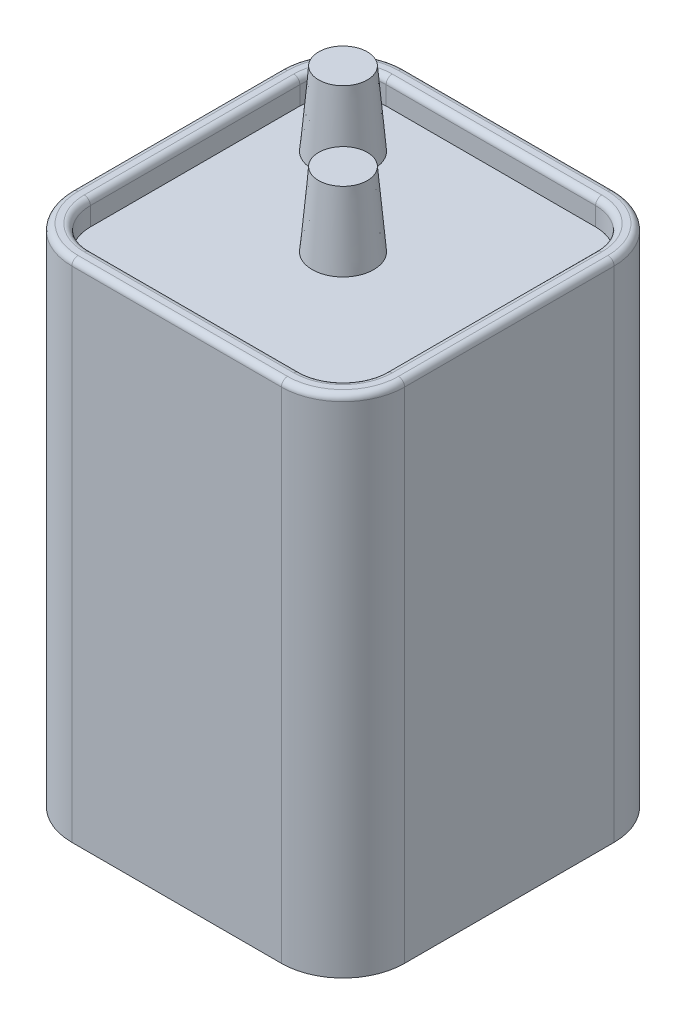
ISO-10303-21;
HEADER;
FILE_DESCRIPTION(('STEP AP214'),'2;1');
FILE_NAME('part.step','',(''),(''),'','','');
FILE_SCHEMA(('AUTOMOTIVE_DESIGN { 1 0 10303 214 1 1 1 1 }'));
ENDSEC;
DATA;
#1=APPLICATION_CONTEXT('core data for automotive mechanical design processes');
#2=APPLICATION_PROTOCOL_DEFINITION('international standard','automotive_design',2000,#1);
#3=PRODUCT_CONTEXT('',#1,'mechanical');
#4=PRODUCT('Part','Part','',(#3));
#5=PRODUCT_RELATED_PRODUCT_CATEGORY('part','',(#4));
#6=PRODUCT_DEFINITION_FORMATION('','',#4);
#7=PRODUCT_DEFINITION_CONTEXT('part definition',#1,'design');
#8=PRODUCT_DEFINITION('design','',#6,#7);
#9=PRODUCT_DEFINITION_SHAPE('','',#8);
#10=(LENGTH_UNIT() NAMED_UNIT(*) SI_UNIT(.MILLI.,.METRE.));
#11=(NAMED_UNIT(*) PLANE_ANGLE_UNIT() SI_UNIT($,.RADIAN.));
#12=(NAMED_UNIT(*) SI_UNIT($,.STERADIAN.) SOLID_ANGLE_UNIT());
#13=UNCERTAINTY_MEASURE_WITH_UNIT(LENGTH_MEASURE(1.E-05),#10,'distance_accuracy_value','');
#14=(GEOMETRIC_REPRESENTATION_CONTEXT(3) GLOBAL_UNCERTAINTY_ASSIGNED_CONTEXT((#13)) GLOBAL_UNIT_ASSIGNED_CONTEXT((#10,
#11,#12)) REPRESENTATION_CONTEXT('',''));
#15=CARTESIAN_POINT('',(0.,0.,0.));
#16=DIRECTION('',(0.,0.,1.));
#17=DIRECTION('',(1.,0.,0.));
#18=AXIS2_PLACEMENT_3D('',#15,#16,#17);
#19=CARTESIAN_POINT('',(34.29,104.14,-34.29));
#20=DIRECTION('',(-1.,0.,0.));
#21=DIRECTION('',(0.,0.,1.));
#22=AXIS2_PLACEMENT_3D('',#19,#20,#21);
#23=PLANE('',#22);
#24=DIRECTION('',(0.,-1.,0.));
#25=VECTOR('',#24,1.);
#26=CARTESIAN_POINT('',(34.29,104.14,-21.59));
#27=LINE('',#26,#25);
#28=CARTESIAN_POINT('',(34.29,0.,-21.59));
#29=VERTEX_POINT('',#28);
#30=CARTESIAN_POINT('',(34.29,102.87,-21.59));
#31=VERTEX_POINT('',#30);
#32=EDGE_CURVE('E334',#29,#31,#27,.F.);
#33=ORIENTED_EDGE('',*,*,#32,.T.);
#34=DIRECTION('',(0.,0.,-1.));
#35=VECTOR('',#34,1.);
#36=CARTESIAN_POINT('',(34.29,102.87,21.59));
#37=LINE('',#36,#35);
#38=CARTESIAN_POINT('',(34.29,102.87,21.59));
#39=VERTEX_POINT('',#38);
#40=EDGE_CURVE('E392',#31,#39,#37,.F.);
#41=ORIENTED_EDGE('',*,*,#40,.T.);
#42=DIRECTION('',(0.,-1.,0.));
#43=VECTOR('',#42,1.);
#44=CARTESIAN_POINT('',(34.29,104.14,21.59));
#45=LINE('',#44,#43);
#46=CARTESIAN_POINT('',(34.29,0.,21.59));
#47=VERTEX_POINT('',#46);
#48=EDGE_CURVE('E331',#39,#47,#45,.T.);
#49=ORIENTED_EDGE('',*,*,#48,.T.);
#50=DIRECTION('',(0.,0.,-1.));
#51=VECTOR('',#50,1.);
#52=CARTESIAN_POINT('',(34.29,0.,-34.29));
#53=LINE('',#52,#51);
#54=EDGE_CURVE('E262',#47,#29,#53,.T.);
#55=ORIENTED_EDGE('',*,*,#54,.T.);
#56=EDGE_LOOP('',(#33,#41,#49,#55));
#57=FACE_BOUND('',#56,.T.);
#58=ADVANCED_FACE('F39',(#57),#23,.F.);
#59=CARTESIAN_POINT('',(-34.29,104.14,-34.29));
#60=DIRECTION('',(0.,0.,1.));
#61=DIRECTION('',(1.,0.,0.));
#62=AXIS2_PLACEMENT_3D('',#59,#60,#61);
#63=PLANE('',#62);
#64=DIRECTION('',(0.,-1.,0.));
#65=VECTOR('',#64,1.);
#66=CARTESIAN_POINT('',(-21.59,104.14,-34.29));
#67=LINE('',#66,#65);
#68=CARTESIAN_POINT('',(-21.59,0.,-34.29));
#69=VERTEX_POINT('',#68);
#70=CARTESIAN_POINT('',(-21.59,102.87,-34.29));
#71=VERTEX_POINT('',#70);
#72=EDGE_CURVE('E320',#69,#71,#67,.F.);
#73=ORIENTED_EDGE('',*,*,#72,.T.);
#74=DIRECTION('',(-1.,0.,0.));
#75=VECTOR('',#74,1.);
#76=CARTESIAN_POINT('',(21.59,102.87,-34.29));
#77=LINE('',#76,#75);
#78=CARTESIAN_POINT('',(21.59,102.87,-34.29));
#79=VERTEX_POINT('',#78);
#80=EDGE_CURVE('E410',#71,#79,#77,.F.);
#81=ORIENTED_EDGE('',*,*,#80,.T.);
#82=DIRECTION('',(0.,-1.,0.));
#83=VECTOR('',#82,1.);
#84=CARTESIAN_POINT('',(21.59,104.14,-34.29));
#85=LINE('',#84,#83);
#86=CARTESIAN_POINT('',(21.59,0.,-34.29));
#87=VERTEX_POINT('',#86);
#88=EDGE_CURVE('E317',#79,#87,#85,.T.);
#89=ORIENTED_EDGE('',*,*,#88,.T.);
#90=DIRECTION('',(-1.,0.,0.));
#91=VECTOR('',#90,1.);
#92=CARTESIAN_POINT('',(-34.29,0.,-34.29));
#93=LINE('',#92,#91);
#94=EDGE_CURVE('E286',#87,#69,#93,.T.);
#95=ORIENTED_EDGE('',*,*,#94,.T.);
#96=EDGE_LOOP('',(#73,#81,#89,#95));
#97=FACE_BOUND('',#96,.T.);
#98=ADVANCED_FACE('F535',(#97),#63,.F.);
#99=CARTESIAN_POINT('',(-34.29,104.14,-34.29));
#100=DIRECTION('',(1.,0.,0.));
#101=DIRECTION('',(0.,0.,-1.));
#102=AXIS2_PLACEMENT_3D('',#99,#100,#101);
#103=PLANE('',#102);
#104=DIRECTION('',(0.,-1.,0.));
#105=VECTOR('',#104,1.);
#106=CARTESIAN_POINT('',(-34.29,104.14,21.59));
#107=LINE('',#106,#105);
#108=CARTESIAN_POINT('',(-34.29,0.,21.59));
#109=VERTEX_POINT('',#108);
#110=CARTESIAN_POINT('',(-34.29,102.87,21.59));
#111=VERTEX_POINT('',#110);
#112=EDGE_CURVE('E298',#109,#111,#107,.F.);
#113=ORIENTED_EDGE('',*,*,#112,.T.);
#114=DIRECTION('',(0.,0.,1.));
#115=VECTOR('',#114,1.);
#116=CARTESIAN_POINT('',(-34.29,102.87,-21.59));
#117=LINE('',#116,#115);
#118=CARTESIAN_POINT('',(-34.29,102.87,-21.59));
#119=VERTEX_POINT('',#118);
#120=EDGE_CURVE('E404',#111,#119,#117,.F.);
#121=ORIENTED_EDGE('',*,*,#120,.T.);
#122=DIRECTION('',(0.,-1.,0.));
#123=VECTOR('',#122,1.);
#124=CARTESIAN_POINT('',(-34.29,104.14,-21.59));
#125=LINE('',#124,#123);
#126=CARTESIAN_POINT('',(-34.29,0.,-21.59));
#127=VERTEX_POINT('',#126);
#128=EDGE_CURVE('E302',#119,#127,#125,.T.);
#129=ORIENTED_EDGE('',*,*,#128,.T.);
#130=DIRECTION('',(0.,0.,1.));
#131=VECTOR('',#130,1.);
#132=CARTESIAN_POINT('',(-34.29,0.,-34.29));
#133=LINE('',#132,#131);
#134=EDGE_CURVE('E290',#127,#109,#133,.T.);
#135=ORIENTED_EDGE('',*,*,#134,.T.);
#136=EDGE_LOOP('',(#113,#121,#129,#135));
#137=FACE_BOUND('',#136,.T.);
#138=ADVANCED_FACE('F541',(#137),#103,.F.);
#139=CARTESIAN_POINT('',(-34.29,104.14,34.29));
#140=DIRECTION('',(0.,0.,-1.));
#141=DIRECTION('',(-1.,0.,0.));
#142=AXIS2_PLACEMENT_3D('',#139,#140,#141);
#143=PLANE('',#142);
#144=DIRECTION('',(0.,-1.,0.));
#145=VECTOR('',#144,1.);
#146=CARTESIAN_POINT('',(21.59,104.14,34.29));
#147=LINE('',#146,#145);
#148=CARTESIAN_POINT('',(21.59,0.,34.29));
#149=VERTEX_POINT('',#148);
#150=CARTESIAN_POINT('',(21.59,102.87,34.29));
#151=VERTEX_POINT('',#150);
#152=EDGE_CURVE('E324',#149,#151,#147,.F.);
#153=ORIENTED_EDGE('',*,*,#152,.T.);
#154=DIRECTION('',(1.,0.,0.));
#155=VECTOR('',#154,1.);
#156=CARTESIAN_POINT('',(-21.59,102.87,34.29));
#157=LINE('',#156,#155);
#158=CARTESIAN_POINT('',(-21.59,102.87,34.29));
#159=VERTEX_POINT('',#158);
#160=EDGE_CURVE('E398',#151,#159,#157,.F.);
#161=ORIENTED_EDGE('',*,*,#160,.T.);
#162=DIRECTION('',(0.,-1.,0.));
#163=VECTOR('',#162,1.);
#164=CARTESIAN_POINT('',(-21.59,104.14,34.29));
#165=LINE('',#164,#163);
#166=CARTESIAN_POINT('',(-21.59,0.,34.29));
#167=VERTEX_POINT('',#166);
#168=EDGE_CURVE('E328',#159,#167,#165,.T.);
#169=ORIENTED_EDGE('',*,*,#168,.T.);
#170=DIRECTION('',(1.,0.,0.));
#171=VECTOR('',#170,1.);
#172=CARTESIAN_POINT('',(-34.29,0.,34.29));
#173=LINE('',#172,#171);
#174=EDGE_CURVE('E294',#167,#149,#173,.T.);
#175=ORIENTED_EDGE('',*,*,#174,.T.);
#176=EDGE_LOOP('',(#153,#161,#169,#175));
#177=FACE_BOUND('',#176,.T.);
#178=ADVANCED_FACE('F740',(#177),#143,.F.);
#179=CARTESIAN_POINT('',(0.,104.14,0.));
#180=DIRECTION('',(0.,1.,0.));
#181=DIRECTION('',(0.,0.,1.));
#182=AXIS2_PLACEMENT_3D('',#179,#180,#181);
#183=PLANE('',#182);
#184=DIRECTION('',(0.,0.,-1.));
#185=VECTOR('',#184,1.);
#186=CARTESIAN_POINT('',(33.02,104.14,-21.59));
#187=LINE('',#186,#185);
#188=CARTESIAN_POINT('',(33.02,104.14,21.59));
#189=VERTEX_POINT('',#188);
#190=CARTESIAN_POINT('',(33.02,104.14,-21.59));
#191=VERTEX_POINT('',#190);
#192=EDGE_CURVE('E381',#189,#191,#187,.T.);
#193=ORIENTED_EDGE('',*,*,#192,.T.);
#194=CARTESIAN_POINT('',(21.59,104.14,-21.59));
#195=DIRECTION('',(0.,1.,0.));
#196=DIRECTION('',(0.,0.,1.));
#197=AXIS2_PLACEMENT_3D('',#194,#195,#196);
#198=CIRCLE('',#197,11.43);
#199=CARTESIAN_POINT('',(21.59,104.14,-33.02));
#200=VERTEX_POINT('',#199);
#201=EDGE_CURVE('E384',#191,#200,#198,.T.);
#202=ORIENTED_EDGE('',*,*,#201,.T.);
#203=DIRECTION('',(-1.,0.,0.));
#204=VECTOR('',#203,1.);
#205=CARTESIAN_POINT('',(-21.59,104.14,-33.02));
#206=LINE('',#205,#204);
#207=CARTESIAN_POINT('',(-21.59,104.14,-33.02));
#208=VERTEX_POINT('',#207);
#209=EDGE_CURVE('E363',#200,#208,#206,.T.);
#210=ORIENTED_EDGE('',*,*,#209,.T.);
#211=CARTESIAN_POINT('',(-21.59,104.14,-21.59));
#212=DIRECTION('',(0.,1.,0.));
#213=DIRECTION('',(0.,0.,1.));
#214=AXIS2_PLACEMENT_3D('',#211,#212,#213);
#215=CIRCLE('',#214,11.43);
#216=CARTESIAN_POINT('',(-33.02,104.14,-21.59));
#217=VERTEX_POINT('',#216);
#218=EDGE_CURVE('E366',#208,#217,#215,.T.);
#219=ORIENTED_EDGE('',*,*,#218,.T.);
#220=DIRECTION('',(0.,0.,1.));
#221=VECTOR('',#220,1.);
#222=CARTESIAN_POINT('',(-33.02,104.14,21.59));
#223=LINE('',#222,#221);
#224=CARTESIAN_POINT('',(-33.02,104.14,21.59));
#225=VERTEX_POINT('',#224);
#226=EDGE_CURVE('E369',#217,#225,#223,.T.);
#227=ORIENTED_EDGE('',*,*,#226,.T.);
#228=CARTESIAN_POINT('',(-21.59,104.14,21.59));
#229=DIRECTION('',(0.,1.,0.));
#230=DIRECTION('',(0.,0.,1.));
#231=AXIS2_PLACEMENT_3D('',#228,#229,#230);
#232=CIRCLE('',#231,11.43);
#233=CARTESIAN_POINT('',(-21.59,104.14,33.02));
#234=VERTEX_POINT('',#233);
#235=EDGE_CURVE('E372',#225,#234,#232,.T.);
#236=ORIENTED_EDGE('',*,*,#235,.T.);
#237=DIRECTION('',(1.,0.,0.));
#238=VECTOR('',#237,1.);
#239=CARTESIAN_POINT('',(21.59,104.14,33.02));
#240=LINE('',#239,#238);
#241=CARTESIAN_POINT('',(21.59,104.14,33.02));
#242=VERTEX_POINT('',#241);
#243=EDGE_CURVE('E375',#234,#242,#240,.T.);
#244=ORIENTED_EDGE('',*,*,#243,.T.);
#245=CARTESIAN_POINT('',(21.59,104.14,21.59));
#246=DIRECTION('',(0.,1.,0.));
#247=DIRECTION('',(0.,0.,1.));
#248=AXIS2_PLACEMENT_3D('',#245,#246,#247);
#249=CIRCLE('',#248,11.43);
#250=EDGE_CURVE('E378',#242,#189,#249,.T.);
#251=ORIENTED_EDGE('',*,*,#250,.T.);
#252=EDGE_LOOP('',(#193,#202,#210,#219,#227,#236,#244,#251));
#253=FACE_BOUND('',#252,.T.);
#254=CARTESIAN_POINT('',(-21.59,104.14,-21.59));
#255=DIRECTION('',(0.,1.,0.));
#256=DIRECTION('',(0.,0.,1.));
#257=AXIS2_PLACEMENT_3D('',#254,#255,#256);
#258=CIRCLE('',#257,10.16);
#259=CARTESIAN_POINT('',(-31.75,104.14,-21.59));
#260=VERTEX_POINT('',#259);
#261=CARTESIAN_POINT('',(-21.59,104.14,-31.75));
#262=VERTEX_POINT('',#261);
#263=EDGE_CURVE('E356',#260,#262,#258,.F.);
#264=ORIENTED_EDGE('',*,*,#263,.T.);
#265=DIRECTION('',(-1.,0.,0.));
#266=VECTOR('',#265,1.);
#267=CARTESIAN_POINT('',(21.59,104.14,-31.75));
#268=LINE('',#267,#266);
#269=CARTESIAN_POINT('',(21.59,104.14,-31.75));
#270=VERTEX_POINT('',#269);
#271=EDGE_CURVE('E359',#262,#270,#268,.F.);
#272=ORIENTED_EDGE('',*,*,#271,.T.);
#273=CARTESIAN_POINT('',(21.59,104.14,-21.59));
#274=DIRECTION('',(0.,1.,0.));
#275=DIRECTION('',(0.,0.,1.));
#276=AXIS2_PLACEMENT_3D('',#273,#274,#275);
#277=CIRCLE('',#276,10.16);
#278=CARTESIAN_POINT('',(31.75,104.14,-21.59));
#279=VERTEX_POINT('',#278);
#280=EDGE_CURVE('E338',#270,#279,#277,.F.);
#281=ORIENTED_EDGE('',*,*,#280,.T.);
#282=DIRECTION('',(0.,0.,-1.));
#283=VECTOR('',#282,1.);
#284=CARTESIAN_POINT('',(31.75,104.14,21.59));
#285=LINE('',#284,#283);
#286=CARTESIAN_POINT('',(31.75,104.14,21.59));
#287=VERTEX_POINT('',#286);
#288=EDGE_CURVE('E341',#279,#287,#285,.F.);
#289=ORIENTED_EDGE('',*,*,#288,.T.);
#290=CARTESIAN_POINT('',(21.59,104.14,21.59));
#291=DIRECTION('',(0.,1.,0.));
#292=DIRECTION('',(0.,0.,1.));
#293=AXIS2_PLACEMENT_3D('',#290,#291,#292);
#294=CIRCLE('',#293,10.16);
#295=CARTESIAN_POINT('',(21.59,104.14,31.75));
#296=VERTEX_POINT('',#295);
#297=EDGE_CURVE('E344',#287,#296,#294,.F.);
#298=ORIENTED_EDGE('',*,*,#297,.T.);
#299=DIRECTION('',(1.,0.,0.));
#300=VECTOR('',#299,1.);
#301=CARTESIAN_POINT('',(-21.59,104.14,31.75));
#302=LINE('',#301,#300);
#303=CARTESIAN_POINT('',(-21.59,104.14,31.75));
#304=VERTEX_POINT('',#303);
#305=EDGE_CURVE('E347',#296,#304,#302,.F.);
#306=ORIENTED_EDGE('',*,*,#305,.T.);
#307=CARTESIAN_POINT('',(-21.59,104.14,21.59));
#308=DIRECTION('',(0.,1.,0.));
#309=DIRECTION('',(0.,0.,1.));
#310=AXIS2_PLACEMENT_3D('',#307,#308,#309);
#311=CIRCLE('',#310,10.16);
#312=CARTESIAN_POINT('',(-31.75,104.14,21.59));
#313=VERTEX_POINT('',#312);
#314=EDGE_CURVE('E350',#304,#313,#311,.F.);
#315=ORIENTED_EDGE('',*,*,#314,.T.);
#316=DIRECTION('',(0.,0.,1.));
#317=VECTOR('',#316,1.);
#318=CARTESIAN_POINT('',(-31.75,104.14,-21.59));
#319=LINE('',#318,#317);
#320=EDGE_CURVE('E353',#313,#260,#319,.F.);
#321=ORIENTED_EDGE('',*,*,#320,.T.);
#322=EDGE_LOOP('',(#264,#272,#281,#289,#298,#306,#315,#321));
#323=FACE_BOUND('',#322,.T.);
#324=ADVANCED_FACE('F496',(#253,#323),#183,.T.);
#325=CARTESIAN_POINT('',(0.,0.,0.));
#326=DIRECTION('',(0.,1.,0.));
#327=DIRECTION('',(0.,0.,1.));
#328=AXIS2_PLACEMENT_3D('',#325,#326,#327);
#329=PLANE('',#328);
#330=ORIENTED_EDGE('',*,*,#134,.F.);
#331=CARTESIAN_POINT('',(-21.59,0.,-21.59));
#332=DIRECTION('',(0.,1.,0.));
#333=DIRECTION('',(0.,0.,1.));
#334=AXIS2_PLACEMENT_3D('',#331,#332,#333);
#335=CIRCLE('',#334,12.7);
#336=EDGE_CURVE('E314',#127,#69,#335,.F.);
#337=ORIENTED_EDGE('',*,*,#336,.T.);
#338=ORIENTED_EDGE('',*,*,#94,.F.);
#339=CARTESIAN_POINT('',(21.59,0.,-21.59));
#340=DIRECTION('',(0.,1.,0.));
#341=DIRECTION('',(0.,0.,1.));
#342=AXIS2_PLACEMENT_3D('',#339,#340,#341);
#343=CIRCLE('',#342,12.7);
#344=EDGE_CURVE('E308',#87,#29,#343,.F.);
#345=ORIENTED_EDGE('',*,*,#344,.T.);
#346=ORIENTED_EDGE('',*,*,#54,.F.);
#347=CARTESIAN_POINT('',(21.59,0.,21.59));
#348=DIRECTION('',(0.,1.,0.));
#349=DIRECTION('',(0.,0.,1.));
#350=AXIS2_PLACEMENT_3D('',#347,#348,#349);
#351=CIRCLE('',#350,12.7);
#352=EDGE_CURVE('E305',#47,#149,#351,.F.);
#353=ORIENTED_EDGE('',*,*,#352,.T.);
#354=ORIENTED_EDGE('',*,*,#174,.F.);
#355=CARTESIAN_POINT('',(-21.59,0.,21.59));
#356=DIRECTION('',(0.,1.,0.));
#357=DIRECTION('',(0.,0.,1.));
#358=AXIS2_PLACEMENT_3D('',#355,#356,#357);
#359=CIRCLE('',#358,12.7);
#360=EDGE_CURVE('E311',#167,#109,#359,.F.);
#361=ORIENTED_EDGE('',*,*,#360,.T.);
#362=EDGE_LOOP('',(#330,#337,#338,#345,#346,#353,#354,#361));
#363=FACE_BOUND('',#362,.T.);
#364=ADVANCED_FACE('F550',(#363),#329,.F.);
#365=CARTESIAN_POINT('',(-21.59,104.14,-21.59));
#366=DIRECTION('',(0.,-1.,0.));
#367=DIRECTION('',(0.,0.,-1.));
#368=AXIS2_PLACEMENT_3D('',#365,#366,#367);
#369=CYLINDRICAL_SURFACE('',#368,12.7);
#370=ORIENTED_EDGE('',*,*,#128,.F.);
#371=CARTESIAN_POINT('',(-21.59,102.87,-21.59));
#372=DIRECTION('',(0.,1.,0.));
#373=DIRECTION('',(0.,0.,1.));
#374=AXIS2_PLACEMENT_3D('',#371,#372,#373);
#375=CIRCLE('',#374,12.7);
#376=EDGE_CURVE('E407',#119,#71,#375,.F.);
#377=ORIENTED_EDGE('',*,*,#376,.T.);
#378=ORIENTED_EDGE('',*,*,#72,.F.);
#379=ORIENTED_EDGE('',*,*,#336,.F.);
#380=EDGE_LOOP('',(#370,#377,#378,#379));
#381=FACE_BOUND('',#380,.T.);
#382=ADVANCED_FACE('F546',(#381),#369,.T.);
#383=CARTESIAN_POINT('',(-21.59,104.14,21.59));
#384=DIRECTION('',(0.,-1.,0.));
#385=DIRECTION('',(0.,0.,-1.));
#386=AXIS2_PLACEMENT_3D('',#383,#384,#385);
#387=CYLINDRICAL_SURFACE('',#386,12.7);
#388=ORIENTED_EDGE('',*,*,#168,.F.);
#389=CARTESIAN_POINT('',(-21.59,102.87,21.59));
#390=DIRECTION('',(0.,1.,0.));
#391=DIRECTION('',(0.,0.,1.));
#392=AXIS2_PLACEMENT_3D('',#389,#390,#391);
#393=CIRCLE('',#392,12.7);
#394=EDGE_CURVE('E401',#159,#111,#393,.F.);
#395=ORIENTED_EDGE('',*,*,#394,.T.);
#396=ORIENTED_EDGE('',*,*,#112,.F.);
#397=ORIENTED_EDGE('',*,*,#360,.F.);
#398=EDGE_LOOP('',(#388,#395,#396,#397));
#399=FACE_BOUND('',#398,.T.);
#400=ADVANCED_FACE('F549',(#399),#387,.T.);
#401=CARTESIAN_POINT('',(21.59,104.14,-21.59));
#402=DIRECTION('',(0.,-1.,0.));
#403=DIRECTION('',(0.,0.,-1.));
#404=AXIS2_PLACEMENT_3D('',#401,#402,#403);
#405=CYLINDRICAL_SURFACE('',#404,12.7);
#406=ORIENTED_EDGE('',*,*,#88,.F.);
#407=CARTESIAN_POINT('',(21.59,102.87,-21.59));
#408=DIRECTION('',(0.,1.,0.));
#409=DIRECTION('',(0.,0.,1.));
#410=AXIS2_PLACEMENT_3D('',#407,#408,#409);
#411=CIRCLE('',#410,12.7);
#412=EDGE_CURVE('E388',#79,#31,#411,.F.);
#413=ORIENTED_EDGE('',*,*,#412,.T.);
#414=ORIENTED_EDGE('',*,*,#32,.F.);
#415=ORIENTED_EDGE('',*,*,#344,.F.);
#416=EDGE_LOOP('',(#406,#413,#414,#415));
#417=FACE_BOUND('',#416,.T.);
#418=ADVANCED_FACE('F554',(#417),#405,.T.);
#419=CARTESIAN_POINT('',(21.59,104.14,21.59));
#420=DIRECTION('',(0.,-1.,0.));
#421=DIRECTION('',(0.,0.,-1.));
#422=AXIS2_PLACEMENT_3D('',#419,#420,#421);
#423=CYLINDRICAL_SURFACE('',#422,12.7);
#424=ORIENTED_EDGE('',*,*,#48,.F.);
#425=CARTESIAN_POINT('',(21.59,102.87,21.59));
#426=DIRECTION('',(0.,1.,0.));
#427=DIRECTION('',(0.,0.,1.));
#428=AXIS2_PLACEMENT_3D('',#425,#426,#427);
#429=CIRCLE('',#428,12.7);
#430=EDGE_CURVE('E395',#39,#151,#429,.F.);
#431=ORIENTED_EDGE('',*,*,#430,.T.);
#432=ORIENTED_EDGE('',*,*,#152,.F.);
#433=ORIENTED_EDGE('',*,*,#352,.F.);
#434=EDGE_LOOP('',(#424,#431,#432,#433));
#435=FACE_BOUND('',#434,.T.);
#436=ADVANCED_FACE('F558',(#435),#423,.T.);
#437=CARTESIAN_POINT('',(21.59,99.06,-21.59));
#438=DIRECTION('',(0.,1.,0.));
#439=DIRECTION('',(0.,0.,1.));
#440=AXIS2_PLACEMENT_3D('',#437,#438,#439);
#441=CYLINDRICAL_SURFACE('',#440,8.89);
#442=DIRECTION('',(0.,1.,0.));
#443=VECTOR('',#442,1.);
#444=CARTESIAN_POINT('',(30.48,99.06,-21.59));
#445=LINE('',#444,#443);
#446=CARTESIAN_POINT('',(30.48,99.06,-21.59));
#447=VERTEX_POINT('',#446);
#448=CARTESIAN_POINT('',(30.48,102.87,-21.59));
#449=VERTEX_POINT('',#448);
#450=EDGE_CURVE('E259',#447,#449,#445,.T.);
#451=ORIENTED_EDGE('',*,*,#450,.T.);
#452=CARTESIAN_POINT('',(21.59,102.87,-21.59));
#453=DIRECTION('',(0.,1.,0.));
#454=DIRECTION('',(0.,0.,1.));
#455=AXIS2_PLACEMENT_3D('',#452,#453,#454);
#456=CIRCLE('',#455,8.89);
#457=CARTESIAN_POINT('',(21.59,102.87,-30.48));
#458=VERTEX_POINT('',#457);
#459=EDGE_CURVE('E11',#449,#458,#456,.T.);
#460=ORIENTED_EDGE('',*,*,#459,.T.);
#461=DIRECTION('',(0.,1.,0.));
#462=VECTOR('',#461,1.);
#463=CARTESIAN_POINT('',(21.59,99.06,-30.48));
#464=LINE('',#463,#462);
#465=CARTESIAN_POINT('',(21.59,99.06,-30.48));
#466=VERTEX_POINT('',#465);
#467=EDGE_CURVE('E202',#466,#458,#464,.T.);
#468=ORIENTED_EDGE('',*,*,#467,.F.);
#469=CARTESIAN_POINT('',(21.59,99.06,-21.59));
#470=DIRECTION('',(0.,1.,0.));
#471=DIRECTION('',(0.,0.,1.));
#472=AXIS2_PLACEMENT_3D('',#469,#470,#471);
#473=CIRCLE('',#472,8.89);
#474=EDGE_CURVE('E206',#447,#466,#473,.T.);
#475=ORIENTED_EDGE('',*,*,#474,.F.);
#476=EDGE_LOOP('',(#451,#460,#468,#475));
#477=FACE_BOUND('',#476,.T.);
#478=ADVANCED_FACE('F204',(#477),#441,.F.);
#479=CARTESIAN_POINT('',(30.48,99.06,21.59));
#480=DIRECTION('',(1.,0.,0.));
#481=DIRECTION('',(0.,0.,-1.));
#482=AXIS2_PLACEMENT_3D('',#479,#480,#481);
#483=PLANE('',#482);
#484=DIRECTION('',(0.,1.,0.));
#485=VECTOR('',#484,1.);
#486=CARTESIAN_POINT('',(30.48,99.06,21.59));
#487=LINE('',#486,#485);
#488=CARTESIAN_POINT('',(30.48,99.06,21.59));
#489=VERTEX_POINT('',#488);
#490=CARTESIAN_POINT('',(30.48,102.87,21.59));
#491=VERTEX_POINT('',#490);
#492=EDGE_CURVE('E263',#489,#491,#487,.T.);
#493=ORIENTED_EDGE('',*,*,#492,.T.);
#494=DIRECTION('',(0.,0.,-1.));
#495=VECTOR('',#494,1.);
#496=CARTESIAN_POINT('',(30.48,102.87,-21.59));
#497=LINE('',#496,#495);
#498=EDGE_CURVE('E49',#491,#449,#497,.T.);
#499=ORIENTED_EDGE('',*,*,#498,.T.);
#500=ORIENTED_EDGE('',*,*,#450,.F.);
#501=DIRECTION('',(0.,0.,-1.));
#502=VECTOR('',#501,1.);
#503=CARTESIAN_POINT('',(30.48,99.06,21.59));
#504=LINE('',#503,#502);
#505=EDGE_CURVE('E214',#489,#447,#504,.T.);
#506=ORIENTED_EDGE('',*,*,#505,.F.);
#507=EDGE_LOOP('',(#493,#499,#500,#506));
#508=FACE_BOUND('',#507,.T.);
#509=ADVANCED_FACE('F524',(#508),#483,.F.);
#510=CARTESIAN_POINT('',(21.59,99.06,21.59));
#511=DIRECTION('',(0.,1.,0.));
#512=DIRECTION('',(0.,0.,1.));
#513=AXIS2_PLACEMENT_3D('',#510,#511,#512);
#514=CYLINDRICAL_SURFACE('',#513,8.89);
#515=DIRECTION('',(0.,1.,0.));
#516=VECTOR('',#515,1.);
#517=CARTESIAN_POINT('',(21.59,99.06,30.48));
#518=LINE('',#517,#516);
#519=CARTESIAN_POINT('',(21.59,99.06,30.48));
#520=VERTEX_POINT('',#519);
#521=CARTESIAN_POINT('',(21.59,102.87,30.48));
#522=VERTEX_POINT('',#521);
#523=EDGE_CURVE('E266',#520,#522,#518,.T.);
#524=ORIENTED_EDGE('',*,*,#523,.T.);
#525=CARTESIAN_POINT('',(21.59,102.87,21.59));
#526=DIRECTION('',(0.,1.,0.));
#527=DIRECTION('',(0.,0.,1.));
#528=AXIS2_PLACEMENT_3D('',#525,#526,#527);
#529=CIRCLE('',#528,8.89);
#530=EDGE_CURVE('E64',#522,#491,#529,.T.);
#531=ORIENTED_EDGE('',*,*,#530,.T.);
#532=ORIENTED_EDGE('',*,*,#492,.F.);
#533=CARTESIAN_POINT('',(21.59,99.06,21.59));
#534=DIRECTION('',(0.,1.,0.));
#535=DIRECTION('',(0.,0.,1.));
#536=AXIS2_PLACEMENT_3D('',#533,#534,#535);
#537=CIRCLE('',#536,8.89);
#538=EDGE_CURVE('E254',#520,#489,#537,.T.);
#539=ORIENTED_EDGE('',*,*,#538,.F.);
#540=EDGE_LOOP('',(#524,#531,#532,#539));
#541=FACE_BOUND('',#540,.T.);
#542=ADVANCED_FACE('F525',(#541),#514,.F.);
#543=CARTESIAN_POINT('',(-21.59,99.06,30.48));
#544=DIRECTION('',(0.,0.,1.));
#545=DIRECTION('',(1.,0.,0.));
#546=AXIS2_PLACEMENT_3D('',#543,#544,#545);
#547=PLANE('',#546);
#548=DIRECTION('',(0.,1.,0.));
#549=VECTOR('',#548,1.);
#550=CARTESIAN_POINT('',(-21.59,99.06,30.48));
#551=LINE('',#550,#549);
#552=CARTESIAN_POINT('',(-21.59,99.06,30.48));
#553=VERTEX_POINT('',#552);
#554=CARTESIAN_POINT('',(-21.59,102.87,30.48));
#555=VERTEX_POINT('',#554);
#556=EDGE_CURVE('E269',#553,#555,#551,.T.);
#557=ORIENTED_EDGE('',*,*,#556,.T.);
#558=DIRECTION('',(1.,0.,0.));
#559=VECTOR('',#558,1.);
#560=CARTESIAN_POINT('',(21.59,102.87,30.48));
#561=LINE('',#560,#559);
#562=EDGE_CURVE('E425',#555,#522,#561,.T.);
#563=ORIENTED_EDGE('',*,*,#562,.T.);
#564=ORIENTED_EDGE('',*,*,#523,.F.);
#565=DIRECTION('',(1.,0.,0.));
#566=VECTOR('',#565,1.);
#567=CARTESIAN_POINT('',(-21.59,99.06,30.48));
#568=LINE('',#567,#566);
#569=EDGE_CURVE('E250',#553,#520,#568,.T.);
#570=ORIENTED_EDGE('',*,*,#569,.F.);
#571=EDGE_LOOP('',(#557,#563,#564,#570));
#572=FACE_BOUND('',#571,.T.);
#573=ADVANCED_FACE('F522',(#572),#547,.F.);
#574=CARTESIAN_POINT('',(-21.59,99.06,21.59));
#575=DIRECTION('',(0.,1.,0.));
#576=DIRECTION('',(0.,0.,1.));
#577=AXIS2_PLACEMENT_3D('',#574,#575,#576);
#578=CYLINDRICAL_SURFACE('',#577,8.89);
#579=DIRECTION('',(0.,1.,0.));
#580=VECTOR('',#579,1.);
#581=CARTESIAN_POINT('',(-30.48,99.06,21.59));
#582=LINE('',#581,#580);
#583=CARTESIAN_POINT('',(-30.48,99.06,21.59));
#584=VERTEX_POINT('',#583);
#585=CARTESIAN_POINT('',(-30.48,102.87,21.59));
#586=VERTEX_POINT('',#585);
#587=EDGE_CURVE('E273',#584,#586,#582,.T.);
#588=ORIENTED_EDGE('',*,*,#587,.T.);
#589=CARTESIAN_POINT('',(-21.59,102.87,21.59));
#590=DIRECTION('',(0.,1.,0.));
#591=DIRECTION('',(0.,0.,1.));
#592=AXIS2_PLACEMENT_3D('',#589,#590,#591);
#593=CIRCLE('',#592,8.89);
#594=EDGE_CURVE('E422',#586,#555,#593,.T.);
#595=ORIENTED_EDGE('',*,*,#594,.T.);
#596=ORIENTED_EDGE('',*,*,#556,.F.);
#597=CARTESIAN_POINT('',(-21.59,99.06,21.59));
#598=DIRECTION('',(0.,1.,0.));
#599=DIRECTION('',(0.,0.,1.));
#600=AXIS2_PLACEMENT_3D('',#597,#598,#599);
#601=CIRCLE('',#600,8.89);
#602=EDGE_CURVE('E246',#584,#553,#601,.T.);
#603=ORIENTED_EDGE('',*,*,#602,.F.);
#604=EDGE_LOOP('',(#588,#595,#596,#603));
#605=FACE_BOUND('',#604,.T.);
#606=ADVANCED_FACE('F519',(#605),#578,.F.);
#607=CARTESIAN_POINT('',(-30.48,99.06,-21.59));
#608=DIRECTION('',(-1.,0.,0.));
#609=DIRECTION('',(0.,0.,1.));
#610=AXIS2_PLACEMENT_3D('',#607,#608,#609);
#611=PLANE('',#610);
#612=DIRECTION('',(0.,1.,0.));
#613=VECTOR('',#612,1.);
#614=CARTESIAN_POINT('',(-30.48,99.06,-21.59));
#615=LINE('',#614,#613);
#616=CARTESIAN_POINT('',(-30.48,99.06,-21.59));
#617=VERTEX_POINT('',#616);
#618=CARTESIAN_POINT('',(-30.48,102.87,-21.59));
#619=VERTEX_POINT('',#618);
#620=EDGE_CURVE('E277',#617,#619,#615,.T.);
#621=ORIENTED_EDGE('',*,*,#620,.T.);
#622=DIRECTION('',(0.,0.,1.));
#623=VECTOR('',#622,1.);
#624=CARTESIAN_POINT('',(-30.48,102.87,21.59));
#625=LINE('',#624,#623);
#626=EDGE_CURVE('E419',#619,#586,#625,.T.);
#627=ORIENTED_EDGE('',*,*,#626,.T.);
#628=ORIENTED_EDGE('',*,*,#587,.F.);
#629=DIRECTION('',(0.,0.,1.));
#630=VECTOR('',#629,1.);
#631=CARTESIAN_POINT('',(-30.48,99.06,-21.59));
#632=LINE('',#631,#630);
#633=EDGE_CURVE('E242',#617,#584,#632,.T.);
#634=ORIENTED_EDGE('',*,*,#633,.F.);
#635=EDGE_LOOP('',(#621,#627,#628,#634));
#636=FACE_BOUND('',#635,.T.);
#637=ADVANCED_FACE('F516',(#636),#611,.F.);
#638=CARTESIAN_POINT('',(-21.59,99.06,-21.59));
#639=DIRECTION('',(0.,1.,0.));
#640=DIRECTION('',(0.,0.,1.));
#641=AXIS2_PLACEMENT_3D('',#638,#639,#640);
#642=CYLINDRICAL_SURFACE('',#641,8.89);
#643=DIRECTION('',(0.,1.,0.));
#644=VECTOR('',#643,1.);
#645=CARTESIAN_POINT('',(-21.59,99.06,-30.48));
#646=LINE('',#645,#644);
#647=CARTESIAN_POINT('',(-21.59,99.06,-30.48));
#648=VERTEX_POINT('',#647);
#649=CARTESIAN_POINT('',(-21.59,102.87,-30.48));
#650=VERTEX_POINT('',#649);
#651=EDGE_CURVE('E213',#648,#650,#646,.T.);
#652=ORIENTED_EDGE('',*,*,#651,.T.);
#653=CARTESIAN_POINT('',(-21.59,102.87,-21.59));
#654=DIRECTION('',(0.,1.,0.));
#655=DIRECTION('',(0.,0.,1.));
#656=AXIS2_PLACEMENT_3D('',#653,#654,#655);
#657=CIRCLE('',#656,8.89);
#658=EDGE_CURVE('E416',#650,#619,#657,.T.);
#659=ORIENTED_EDGE('',*,*,#658,.T.);
#660=ORIENTED_EDGE('',*,*,#620,.F.);
#661=CARTESIAN_POINT('',(-21.59,99.06,-21.59));
#662=DIRECTION('',(0.,1.,0.));
#663=DIRECTION('',(0.,0.,1.));
#664=AXIS2_PLACEMENT_3D('',#661,#662,#663);
#665=CIRCLE('',#664,8.89);
#666=EDGE_CURVE('E224',#648,#617,#665,.T.);
#667=ORIENTED_EDGE('',*,*,#666,.F.);
#668=EDGE_LOOP('',(#652,#659,#660,#667));
#669=FACE_BOUND('',#668,.T.);
#670=ADVANCED_FACE('F512',(#669),#642,.F.);
#671=CARTESIAN_POINT('',(21.59,99.06,-30.48));
#672=DIRECTION('',(0.,0.,-1.));
#673=DIRECTION('',(-1.,0.,0.));
#674=AXIS2_PLACEMENT_3D('',#671,#672,#673);
#675=PLANE('',#674);
#676=ORIENTED_EDGE('',*,*,#467,.T.);
#677=DIRECTION('',(-1.,0.,0.));
#678=VECTOR('',#677,1.);
#679=CARTESIAN_POINT('',(-21.59,102.87,-30.48));
#680=LINE('',#679,#678);
#681=EDGE_CURVE('E413',#458,#650,#680,.T.);
#682=ORIENTED_EDGE('',*,*,#681,.T.);
#683=ORIENTED_EDGE('',*,*,#651,.F.);
#684=DIRECTION('',(-1.,0.,0.));
#685=VECTOR('',#684,1.);
#686=CARTESIAN_POINT('',(21.59,99.06,-30.48));
#687=LINE('',#686,#685);
#688=EDGE_CURVE('E217',#466,#648,#687,.T.);
#689=ORIENTED_EDGE('',*,*,#688,.F.);
#690=EDGE_LOOP('',(#676,#682,#683,#689));
#691=FACE_BOUND('',#690,.T.);
#692=ADVANCED_FACE('F218',(#691),#675,.F.);
#693=CARTESIAN_POINT('',(21.59,99.06,-21.59));
#694=DIRECTION('',(0.,1.,0.));
#695=DIRECTION('',(0.,0.,1.));
#696=AXIS2_PLACEMENT_3D('',#693,#694,#695);
#697=PLANE('',#696);
#698=CARTESIAN_POINT('',(-17.9605122421382,99.06,-17.9605122421384));
#699=DIRECTION('',(0.,1.,0.));
#700=DIRECTION('',(0.,0.,1.));
#701=AXIS2_PLACEMENT_3D('',#698,#699,#700);
#702=CIRCLE('',#701,6.34999999999999);
#703=CARTESIAN_POINT('',(-17.9605122421382,99.06,-11.6105122421384));
#704=VERTEX_POINT('',#703);
#705=EDGE_CURVE('E929',#704,#704,#702,.T.);
#706=ORIENTED_EDGE('',*,*,#705,.F.);
#707=EDGE_LOOP('',(#706));
#708=FACE_BOUND('',#707,.T.);
#709=CARTESIAN_POINT('',(0.,99.06,0.));
#710=DIRECTION('',(0.,1.,0.));
#711=DIRECTION('',(0.,0.,1.));
#712=AXIS2_PLACEMENT_3D('',#709,#710,#711);
#713=CIRCLE('',#712,6.35);
#714=CARTESIAN_POINT('',(0.,99.06,6.35));
#715=VERTEX_POINT('',#714);
#716=EDGE_CURVE('E928',#715,#715,#713,.T.);
#717=ORIENTED_EDGE('',*,*,#716,.F.);
#718=EDGE_LOOP('',(#717));
#719=FACE_BOUND('',#718,.T.);
#720=ORIENTED_EDGE('',*,*,#474,.T.);
#721=ORIENTED_EDGE('',*,*,#688,.T.);
#722=ORIENTED_EDGE('',*,*,#666,.T.);
#723=ORIENTED_EDGE('',*,*,#633,.T.);
#724=ORIENTED_EDGE('',*,*,#602,.T.);
#725=ORIENTED_EDGE('',*,*,#569,.T.);
#726=ORIENTED_EDGE('',*,*,#538,.T.);
#727=ORIENTED_EDGE('',*,*,#505,.T.);
#728=EDGE_LOOP('',(#720,#721,#722,#723,#724,#725,#726,#727));
#729=FACE_BOUND('',#728,.T.);
#730=ADVANCED_FACE('F226',(#708,#719,#729),#697,.T.);
#731=CARTESIAN_POINT('',(-21.59,102.87,21.59));
#732=DIRECTION('',(0.,1.,0.));
#733=DIRECTION('',(0.,0.,1.));
#734=AXIS2_PLACEMENT_3D('',#731,#732,#733);
#735=TOROIDAL_SURFACE('',#734,11.43,1.27);
#736=CARTESIAN_POINT('',(-33.02,102.87,21.59));
#737=DIRECTION('',(0.,0.,-1.));
#738=DIRECTION('',(-1.,0.,0.));
#739=AXIS2_PLACEMENT_3D('',#736,#737,#738);
#740=CIRCLE('',#739,1.27);
#741=EDGE_CURVE('E234',#111,#225,#740,.T.);
#742=ORIENTED_EDGE('',*,*,#741,.F.);
#743=ORIENTED_EDGE('',*,*,#394,.F.);
#744=CARTESIAN_POINT('',(-21.59,102.87,33.02));
#745=DIRECTION('',(1.,0.,0.));
#746=DIRECTION('',(0.,0.,-1.));
#747=AXIS2_PLACEMENT_3D('',#744,#745,#746);
#748=CIRCLE('',#747,1.27);
#749=EDGE_CURVE('E230',#234,#159,#748,.T.);
#750=ORIENTED_EDGE('',*,*,#749,.F.);
#751=ORIENTED_EDGE('',*,*,#235,.F.);
#752=EDGE_LOOP('',(#742,#743,#750,#751));
#753=FACE_BOUND('',#752,.T.);
#754=ADVANCED_FACE('F590',(#753),#735,.T.);
#755=CARTESIAN_POINT('',(0.,102.87,33.02));
#756=DIRECTION('',(-1.,0.,0.));
#757=DIRECTION('',(0.,0.,1.));
#758=AXIS2_PLACEMENT_3D('',#755,#756,#757);
#759=CYLINDRICAL_SURFACE('',#758,1.27);
#760=ORIENTED_EDGE('',*,*,#749,.T.);
#761=ORIENTED_EDGE('',*,*,#160,.F.);
#762=CARTESIAN_POINT('',(21.59,102.87,33.02));
#763=DIRECTION('',(1.,0.,0.));
#764=DIRECTION('',(0.,0.,-1.));
#765=AXIS2_PLACEMENT_3D('',#762,#763,#764);
#766=CIRCLE('',#765,1.27);
#767=EDGE_CURVE('E450',#242,#151,#766,.T.);
#768=ORIENTED_EDGE('',*,*,#767,.F.);
#769=ORIENTED_EDGE('',*,*,#243,.F.);
#770=EDGE_LOOP('',(#760,#761,#768,#769));
#771=FACE_BOUND('',#770,.T.);
#772=ADVANCED_FACE('F586',(#771),#759,.T.);
#773=CARTESIAN_POINT('',(-33.02,102.87,0.));
#774=DIRECTION('',(0.,0.,-1.));
#775=DIRECTION('',(-1.,0.,0.));
#776=AXIS2_PLACEMENT_3D('',#773,#774,#775);
#777=CYLINDRICAL_SURFACE('',#776,1.27);
#778=ORIENTED_EDGE('',*,*,#741,.T.);
#779=ORIENTED_EDGE('',*,*,#226,.F.);
#780=CARTESIAN_POINT('',(-33.02,102.87,-21.59));
#781=DIRECTION('',(0.,0.,-1.));
#782=DIRECTION('',(-1.,0.,0.));
#783=AXIS2_PLACEMENT_3D('',#780,#781,#782);
#784=CIRCLE('',#783,1.27);
#785=EDGE_CURVE('E446',#119,#217,#784,.T.);
#786=ORIENTED_EDGE('',*,*,#785,.F.);
#787=ORIENTED_EDGE('',*,*,#120,.F.);
#788=EDGE_LOOP('',(#778,#779,#786,#787));
#789=FACE_BOUND('',#788,.T.);
#790=ADVANCED_FACE('F582',(#789),#777,.T.);
#791=CARTESIAN_POINT('',(21.59,102.87,21.59));
#792=DIRECTION('',(0.,1.,0.));
#793=DIRECTION('',(0.,0.,1.));
#794=AXIS2_PLACEMENT_3D('',#791,#792,#793);
#795=TOROIDAL_SURFACE('',#794,11.43,1.27);
#796=ORIENTED_EDGE('',*,*,#767,.T.);
#797=ORIENTED_EDGE('',*,*,#430,.F.);
#798=CARTESIAN_POINT('',(33.02,102.87,21.59));
#799=DIRECTION('',(0.,0.,-1.));
#800=DIRECTION('',(-1.,0.,0.));
#801=AXIS2_PLACEMENT_3D('',#798,#799,#800);
#802=CIRCLE('',#801,1.27);
#803=EDGE_CURVE('E442',#189,#39,#802,.T.);
#804=ORIENTED_EDGE('',*,*,#803,.F.);
#805=ORIENTED_EDGE('',*,*,#250,.F.);
#806=EDGE_LOOP('',(#796,#797,#804,#805));
#807=FACE_BOUND('',#806,.T.);
#808=ADVANCED_FACE('F578',(#807),#795,.T.);
#809=CARTESIAN_POINT('',(-21.59,102.87,-21.59));
#810=DIRECTION('',(0.,1.,0.));
#811=DIRECTION('',(0.,0.,1.));
#812=AXIS2_PLACEMENT_3D('',#809,#810,#811);
#813=TOROIDAL_SURFACE('',#812,11.43,1.27);
#814=ORIENTED_EDGE('',*,*,#785,.T.);
#815=ORIENTED_EDGE('',*,*,#218,.F.);
#816=CARTESIAN_POINT('',(-21.59,102.87,-33.02));
#817=DIRECTION('',(1.,0.,0.));
#818=DIRECTION('',(0.,0.,-1.));
#819=AXIS2_PLACEMENT_3D('',#816,#817,#818);
#820=CIRCLE('',#819,1.27);
#821=EDGE_CURVE('E438',#71,#208,#820,.T.);
#822=ORIENTED_EDGE('',*,*,#821,.F.);
#823=ORIENTED_EDGE('',*,*,#376,.F.);
#824=EDGE_LOOP('',(#814,#815,#822,#823));
#825=FACE_BOUND('',#824,.T.);
#826=ADVANCED_FACE('F574',(#825),#813,.T.);
#827=CARTESIAN_POINT('',(33.02,102.87,0.));
#828=DIRECTION('',(0.,0.,1.));
#829=DIRECTION('',(1.,0.,0.));
#830=AXIS2_PLACEMENT_3D('',#827,#828,#829);
#831=CYLINDRICAL_SURFACE('',#830,1.27);
#832=ORIENTED_EDGE('',*,*,#803,.T.);
#833=ORIENTED_EDGE('',*,*,#40,.F.);
#834=CARTESIAN_POINT('',(33.02,102.87,-21.59));
#835=DIRECTION('',(0.,0.,-1.));
#836=DIRECTION('',(-1.,0.,0.));
#837=AXIS2_PLACEMENT_3D('',#834,#835,#836);
#838=CIRCLE('',#837,1.27);
#839=EDGE_CURVE('E435',#191,#31,#838,.T.);
#840=ORIENTED_EDGE('',*,*,#839,.F.);
#841=ORIENTED_EDGE('',*,*,#192,.F.);
#842=EDGE_LOOP('',(#832,#833,#840,#841));
#843=FACE_BOUND('',#842,.T.);
#844=ADVANCED_FACE('F570',(#843),#831,.T.);
#845=CARTESIAN_POINT('',(0.,102.87,-33.02));
#846=DIRECTION('',(1.,0.,0.));
#847=DIRECTION('',(0.,0.,-1.));
#848=AXIS2_PLACEMENT_3D('',#845,#846,#847);
#849=CYLINDRICAL_SURFACE('',#848,1.27);
#850=ORIENTED_EDGE('',*,*,#821,.T.);
#851=ORIENTED_EDGE('',*,*,#209,.F.);
#852=CARTESIAN_POINT('',(21.59,102.87,-33.02));
#853=DIRECTION('',(1.,0.,0.));
#854=DIRECTION('',(0.,0.,-1.));
#855=AXIS2_PLACEMENT_3D('',#852,#853,#854);
#856=CIRCLE('',#855,1.27);
#857=EDGE_CURVE('E432',#79,#200,#856,.T.);
#858=ORIENTED_EDGE('',*,*,#857,.F.);
#859=ORIENTED_EDGE('',*,*,#80,.F.);
#860=EDGE_LOOP('',(#850,#851,#858,#859));
#861=FACE_BOUND('',#860,.T.);
#862=ADVANCED_FACE('F566',(#861),#849,.T.);
#863=CARTESIAN_POINT('',(21.59,102.87,-21.59));
#864=DIRECTION('',(0.,1.,0.));
#865=DIRECTION('',(0.,0.,1.));
#866=AXIS2_PLACEMENT_3D('',#863,#864,#865);
#867=TOROIDAL_SURFACE('',#866,11.43,1.27);
#868=ORIENTED_EDGE('',*,*,#839,.T.);
#869=ORIENTED_EDGE('',*,*,#412,.F.);
#870=ORIENTED_EDGE('',*,*,#857,.T.);
#871=ORIENTED_EDGE('',*,*,#201,.F.);
#872=EDGE_LOOP('',(#868,#869,#870,#871));
#873=FACE_BOUND('',#872,.T.);
#874=ADVANCED_FACE('F563',(#873),#867,.T.);
#875=CARTESIAN_POINT('',(-21.59,102.87,31.75));
#876=DIRECTION('',(-1.,0.,0.));
#877=DIRECTION('',(0.,0.,1.));
#878=AXIS2_PLACEMENT_3D('',#875,#876,#877);
#879=CYLINDRICAL_SURFACE('',#878,1.27);
#880=CARTESIAN_POINT('',(-21.59,102.87,31.75));
#881=DIRECTION('',(-1.,0.,0.));
#882=DIRECTION('',(0.,0.,1.));
#883=AXIS2_PLACEMENT_3D('',#880,#881,#882);
#884=CIRCLE('',#883,1.27);
#885=EDGE_CURVE('E478',#304,#555,#884,.T.);
#886=ORIENTED_EDGE('',*,*,#885,.F.);
#887=ORIENTED_EDGE('',*,*,#305,.F.);
#888=CARTESIAN_POINT('',(21.59,102.87,31.75));
#889=DIRECTION('',(1.,0.,0.));
#890=DIRECTION('',(0.,0.,-1.));
#891=AXIS2_PLACEMENT_3D('',#888,#889,#890);
#892=CIRCLE('',#891,1.27);
#893=EDGE_CURVE('E43',#522,#296,#892,.T.);
#894=ORIENTED_EDGE('',*,*,#893,.F.);
#895=ORIENTED_EDGE('',*,*,#562,.F.);
#896=EDGE_LOOP('',(#886,#887,#894,#895));
#897=FACE_BOUND('',#896,.T.);
#898=ADVANCED_FACE('F41',(#897),#879,.T.);
#899=CARTESIAN_POINT('',(21.59,102.87,21.59));
#900=DIRECTION('',(0.,1.,0.));
#901=DIRECTION('',(0.,0.,1.));
#902=AXIS2_PLACEMENT_3D('',#899,#900,#901);
#903=TOROIDAL_SURFACE('',#902,10.16,1.27);
#904=ORIENTED_EDGE('',*,*,#893,.T.);
#905=ORIENTED_EDGE('',*,*,#297,.F.);
#906=CARTESIAN_POINT('',(31.75,102.87,21.59));
#907=DIRECTION('',(0.,0.,-1.));
#908=DIRECTION('',(-1.,0.,0.));
#909=AXIS2_PLACEMENT_3D('',#906,#907,#908);
#910=CIRCLE('',#909,1.27);
#911=EDGE_CURVE('E475',#491,#287,#910,.T.);
#912=ORIENTED_EDGE('',*,*,#911,.F.);
#913=ORIENTED_EDGE('',*,*,#530,.F.);
#914=EDGE_LOOP('',(#904,#905,#912,#913));
#915=FACE_BOUND('',#914,.T.);
#916=ADVANCED_FACE('F490',(#915),#903,.T.);
#917=CARTESIAN_POINT('',(-21.59,102.87,21.59));
#918=DIRECTION('',(0.,1.,0.));
#919=DIRECTION('',(0.,0.,1.));
#920=AXIS2_PLACEMENT_3D('',#917,#918,#919);
#921=TOROIDAL_SURFACE('',#920,10.16,1.27);
#922=ORIENTED_EDGE('',*,*,#885,.T.);
#923=ORIENTED_EDGE('',*,*,#594,.F.);
#924=CARTESIAN_POINT('',(-31.75,102.87,21.59));
#925=DIRECTION('',(0.,0.,-1.));
#926=DIRECTION('',(-1.,0.,0.));
#927=AXIS2_PLACEMENT_3D('',#924,#925,#926);
#928=CIRCLE('',#927,1.27);
#929=EDGE_CURVE('E471',#313,#586,#928,.T.);
#930=ORIENTED_EDGE('',*,*,#929,.F.);
#931=ORIENTED_EDGE('',*,*,#314,.F.);
#932=EDGE_LOOP('',(#922,#923,#930,#931));
#933=FACE_BOUND('',#932,.T.);
#934=ADVANCED_FACE('F610',(#933),#921,.T.);
#935=CARTESIAN_POINT('',(31.75,102.87,21.59));
#936=DIRECTION('',(0.,0.,1.));
#937=DIRECTION('',(1.,0.,0.));
#938=AXIS2_PLACEMENT_3D('',#935,#936,#937);
#939=CYLINDRICAL_SURFACE('',#938,1.27);
#940=ORIENTED_EDGE('',*,*,#911,.T.);
#941=ORIENTED_EDGE('',*,*,#288,.F.);
#942=CARTESIAN_POINT('',(31.75,102.87,-21.59));
#943=DIRECTION('',(0.,0.,-1.));
#944=DIRECTION('',(-1.,0.,0.));
#945=AXIS2_PLACEMENT_3D('',#942,#943,#944);
#946=CIRCLE('',#945,1.27);
#947=EDGE_CURVE('E467',#449,#279,#946,.T.);
#948=ORIENTED_EDGE('',*,*,#947,.F.);
#949=ORIENTED_EDGE('',*,*,#498,.F.);
#950=EDGE_LOOP('',(#940,#941,#948,#949));
#951=FACE_BOUND('',#950,.T.);
#952=ADVANCED_FACE('F502',(#951),#939,.T.);
#953=CARTESIAN_POINT('',(-31.75,102.87,-21.59));
#954=DIRECTION('',(0.,0.,-1.));
#955=DIRECTION('',(-1.,0.,0.));
#956=AXIS2_PLACEMENT_3D('',#953,#954,#955);
#957=CYLINDRICAL_SURFACE('',#956,1.27);
#958=ORIENTED_EDGE('',*,*,#929,.T.);
#959=ORIENTED_EDGE('',*,*,#626,.F.);
#960=CARTESIAN_POINT('',(-31.75,102.87,-21.59));
#961=DIRECTION('',(0.,0.,-1.));
#962=DIRECTION('',(-1.,0.,0.));
#963=AXIS2_PLACEMENT_3D('',#960,#961,#962);
#964=CIRCLE('',#963,1.27);
#965=EDGE_CURVE('E463',#260,#619,#964,.T.);
#966=ORIENTED_EDGE('',*,*,#965,.F.);
#967=ORIENTED_EDGE('',*,*,#320,.F.);
#968=EDGE_LOOP('',(#958,#959,#966,#967));
#969=FACE_BOUND('',#968,.T.);
#970=ADVANCED_FACE('F604',(#969),#957,.T.);
#971=CARTESIAN_POINT('',(21.59,102.87,-21.59));
#972=DIRECTION('',(0.,1.,0.));
#973=DIRECTION('',(0.,0.,1.));
#974=AXIS2_PLACEMENT_3D('',#971,#972,#973);
#975=TOROIDAL_SURFACE('',#974,10.16,1.27);
#976=ORIENTED_EDGE('',*,*,#947,.T.);
#977=ORIENTED_EDGE('',*,*,#280,.F.);
#978=CARTESIAN_POINT('',(21.59,102.87,-31.75));
#979=DIRECTION('',(-1.,0.,0.));
#980=DIRECTION('',(0.,0.,1.));
#981=AXIS2_PLACEMENT_3D('',#978,#979,#980);
#982=CIRCLE('',#981,1.27);
#983=EDGE_CURVE('E460',#458,#270,#982,.T.);
#984=ORIENTED_EDGE('',*,*,#983,.F.);
#985=ORIENTED_EDGE('',*,*,#459,.F.);
#986=EDGE_LOOP('',(#976,#977,#984,#985));
#987=FACE_BOUND('',#986,.T.);
#988=ADVANCED_FACE('F504',(#987),#975,.T.);
#989=CARTESIAN_POINT('',(-21.59,102.87,-21.59));
#990=DIRECTION('',(0.,1.,0.));
#991=DIRECTION('',(0.,0.,1.));
#992=AXIS2_PLACEMENT_3D('',#989,#990,#991);
#993=TOROIDAL_SURFACE('',#992,10.16,1.27);
#994=ORIENTED_EDGE('',*,*,#965,.T.);
#995=ORIENTED_EDGE('',*,*,#658,.F.);
#996=CARTESIAN_POINT('',(-21.59,102.87,-31.75));
#997=DIRECTION('',(1.,0.,0.));
#998=DIRECTION('',(0.,0.,-1.));
#999=AXIS2_PLACEMENT_3D('',#996,#997,#998);
#1000=CIRCLE('',#999,1.27);
#1001=EDGE_CURVE('E457',#262,#650,#1000,.T.);
#1002=ORIENTED_EDGE('',*,*,#1001,.F.);
#1003=ORIENTED_EDGE('',*,*,#263,.F.);
#1004=EDGE_LOOP('',(#994,#995,#1002,#1003));
#1005=FACE_BOUND('',#1004,.T.);
#1006=ADVANCED_FACE('F598',(#1005),#993,.T.);
#1007=CARTESIAN_POINT('',(21.59,102.87,-31.75));
#1008=DIRECTION('',(1.,0.,0.));
#1009=DIRECTION('',(0.,0.,-1.));
#1010=AXIS2_PLACEMENT_3D('',#1007,#1008,#1009);
#1011=CYLINDRICAL_SURFACE('',#1010,1.27);
#1012=ORIENTED_EDGE('',*,*,#983,.T.);
#1013=ORIENTED_EDGE('',*,*,#271,.F.);
#1014=ORIENTED_EDGE('',*,*,#1001,.T.);
#1015=ORIENTED_EDGE('',*,*,#681,.F.);
#1016=EDGE_LOOP('',(#1012,#1013,#1014,#1015));
#1017=FACE_BOUND('',#1016,.T.);
#1018=ADVANCED_FACE('F508',(#1017),#1011,.T.);
#1019=CARTESIAN_POINT('',(0.,99.06,0.));
#1020=DIRECTION('',(0.,-1.,0.));
#1021=DIRECTION('',(0.,0.,1.));
#1022=AXIS2_PLACEMENT_3D('',#1019,#1020,#1021);
#1023=CONICAL_SURFACE('',#1022,6.35,0.0872664625997167);
#1024=CARTESIAN_POINT('',(0.,114.3,0.));
#1025=DIRECTION('',(0.,1.,0.));
#1026=DIRECTION('',(0.,0.,1.));
#1027=AXIS2_PLACEMENT_3D('',#1024,#1025,#1026);
#1028=CIRCLE('',#1027,5.01667276786491);
#1029=CARTESIAN_POINT('',(0.,114.3,5.01667276786491));
#1030=VERTEX_POINT('',#1029);
#1031=EDGE_CURVE('E237',#1030,#1030,#1028,.T.);
#1032=ORIENTED_EDGE('',*,*,#1031,.F.);
#1033=EDGE_LOOP('',(#1032));
#1034=FACE_BOUND('',#1033,.T.);
#1035=ORIENTED_EDGE('',*,*,#716,.T.);
#1036=EDGE_LOOP('',(#1035));
#1037=FACE_BOUND('',#1036,.T.);
#1038=ADVANCED_FACE('F597',(#1034,#1037),#1023,.T.);
#1039=CARTESIAN_POINT('',(0.,114.3,0.));
#1040=DIRECTION('',(0.,1.,0.));
#1041=DIRECTION('',(0.,0.,1.));
#1042=AXIS2_PLACEMENT_3D('',#1039,#1040,#1041);
#1043=PLANE('',#1042);
#1044=ORIENTED_EDGE('',*,*,#1031,.T.);
#1045=EDGE_LOOP('',(#1044));
#1046=FACE_BOUND('',#1045,.T.);
#1047=ADVANCED_FACE('F885',(#1046),#1043,.T.);
#1048=CARTESIAN_POINT('',(-17.9605122421382,99.06,-17.9605122421384));
#1049=DIRECTION('',(0.,-1.,0.));
#1050=DIRECTION('',(0.,0.,1.));
#1051=AXIS2_PLACEMENT_3D('',#1048,#1049,#1050);
#1052=CONICAL_SURFACE('',#1051,6.34999999999999,0.0872664625997167);
#1053=CARTESIAN_POINT('',(-17.9605122421382,114.3,-17.9605122421384));
#1054=DIRECTION('',(0.,1.,0.));
#1055=DIRECTION('',(0.,0.,1.));
#1056=AXIS2_PLACEMENT_3D('',#1053,#1054,#1055);
#1057=CIRCLE('',#1056,5.0166727678649);
#1058=CARTESIAN_POINT('',(-17.9605122421382,114.3,-12.9438394742735));
#1059=VERTEX_POINT('',#1058);
#1060=EDGE_CURVE('E926',#1059,#1059,#1057,.T.);
#1061=ORIENTED_EDGE('',*,*,#1060,.F.);
#1062=EDGE_LOOP('',(#1061));
#1063=FACE_BOUND('',#1062,.T.);
#1064=ORIENTED_EDGE('',*,*,#705,.T.);
#1065=EDGE_LOOP('',(#1064));
#1066=FACE_BOUND('',#1065,.T.);
#1067=ADVANCED_FACE('F894',(#1063,#1066),#1052,.T.);
#1068=CARTESIAN_POINT('',(-17.9605122421382,114.3,-17.9605122421384));
#1069=DIRECTION('',(0.,1.,0.));
#1070=DIRECTION('',(0.,0.,1.));
#1071=AXIS2_PLACEMENT_3D('',#1068,#1069,#1070);
#1072=PLANE('',#1071);
#1073=ORIENTED_EDGE('',*,*,#1060,.T.);
#1074=EDGE_LOOP('',(#1073));
#1075=FACE_BOUND('',#1074,.T.);
#1076=ADVANCED_FACE('F903',(#1075),#1072,.T.);
#1077=CLOSED_SHELL('',(#58,#98,#138,#178,#324,#364,#382,#400,#418,#436,#478,#509,#542,#573,#606,
#637,#670,#692,#730,#754,#772,#790,#808,#826,#844,#862,#874,#898,#916,#934,#952,#970,#988,#1006,
#1018,#1038,#1047,#1067,#1076));
#1078=MANIFOLD_SOLID_BREP('B2',#1077);
#1079=ADVANCED_BREP_SHAPE_REPRESENTATION('',(#18,#1078),#14);
#1080=SHAPE_DEFINITION_REPRESENTATION(#9,#1079);
ENDSEC;
END-ISO-10303-21;
